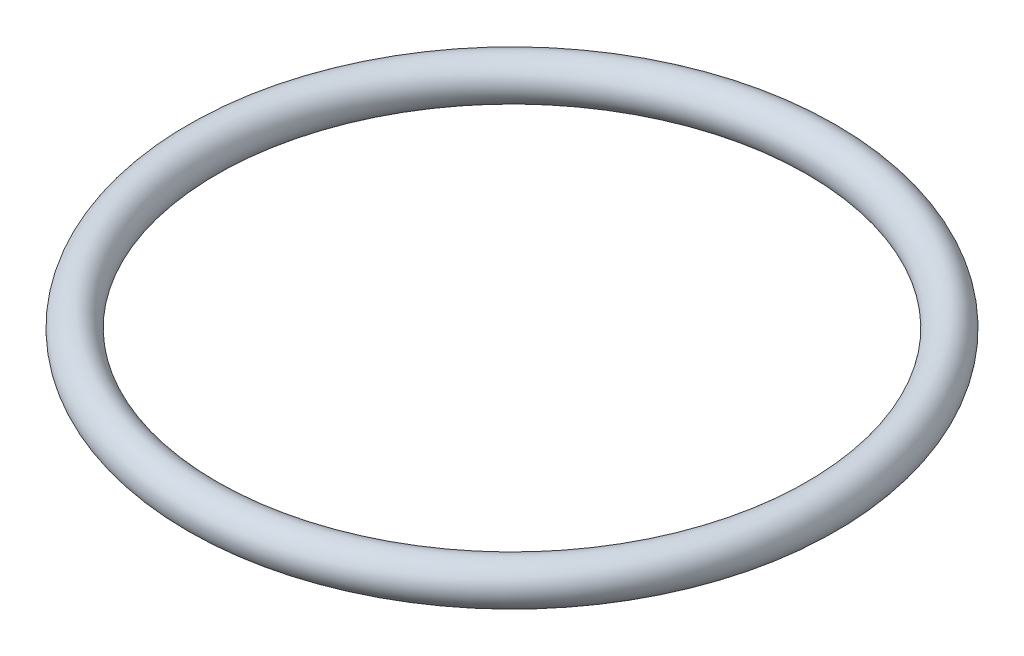
ISO-10303-21;
HEADER;
FILE_DESCRIPTION(('STEP AP214'),'2;1');
FILE_NAME('part.step','',(''),(''),'','','');
FILE_SCHEMA(('AUTOMOTIVE_DESIGN { 1 0 10303 214 1 1 1 1 }'));
ENDSEC;
DATA;
#1=APPLICATION_CONTEXT('core data for automotive mechanical design processes');
#2=APPLICATION_PROTOCOL_DEFINITION('international standard','automotive_design',2000,#1);
#3=PRODUCT_CONTEXT('',#1,'mechanical');
#4=PRODUCT('Part','Part','',(#3));
#5=PRODUCT_RELATED_PRODUCT_CATEGORY('part','',(#4));
#6=PRODUCT_DEFINITION_FORMATION('','',#4);
#7=PRODUCT_DEFINITION_CONTEXT('part definition',#1,'design');
#8=PRODUCT_DEFINITION('design','',#6,#7);
#9=PRODUCT_DEFINITION_SHAPE('','',#8);
#10=(LENGTH_UNIT() NAMED_UNIT(*) SI_UNIT(.MILLI.,.METRE.));
#11=(NAMED_UNIT(*) PLANE_ANGLE_UNIT() SI_UNIT($,.RADIAN.));
#12=(NAMED_UNIT(*) SI_UNIT($,.STERADIAN.) SOLID_ANGLE_UNIT());
#13=UNCERTAINTY_MEASURE_WITH_UNIT(LENGTH_MEASURE(1.E-05),#10,'distance_accuracy_value','');
#14=(GEOMETRIC_REPRESENTATION_CONTEXT(3) GLOBAL_UNCERTAINTY_ASSIGNED_CONTEXT((#13)) GLOBAL_UNIT_ASSIGNED_CONTEXT((#10,
#11,#12)) REPRESENTATION_CONTEXT('',''));
#15=CARTESIAN_POINT('',(0.,0.,0.));
#16=DIRECTION('',(0.,0.,1.));
#17=DIRECTION('',(1.,0.,0.));
#18=AXIS2_PLACEMENT_3D('',#15,#16,#17);
#19=CARTESIAN_POINT('',(107.,0.,0.));
#20=DIRECTION('',(0.,-1.,0.));
#21=DIRECTION('',(0.,0.,-1.));
#22=AXIS2_PLACEMENT_3D('',#19,#20,#21);
#23=TOROIDAL_SURFACE('',#22,107.,7.);
#24=CARTESIAN_POINT('',(107.,0.,-114.));
#25=VERTEX_POINT('',#24);
#26=VERTEX_LOOP('',#25);
#27=FACE_BOUND('',#26,.T.);
#28=ADVANCED_FACE('F35',(#27),#23,.T.);
#29=CLOSED_SHELL('',(#28));
#30=MANIFOLD_SOLID_BREP('B2',#29);
#31=ADVANCED_BREP_SHAPE_REPRESENTATION('',(#18,#30),#14);
#32=SHAPE_DEFINITION_REPRESENTATION(#9,#31);
ENDSEC;
END-ISO-10303-21;
